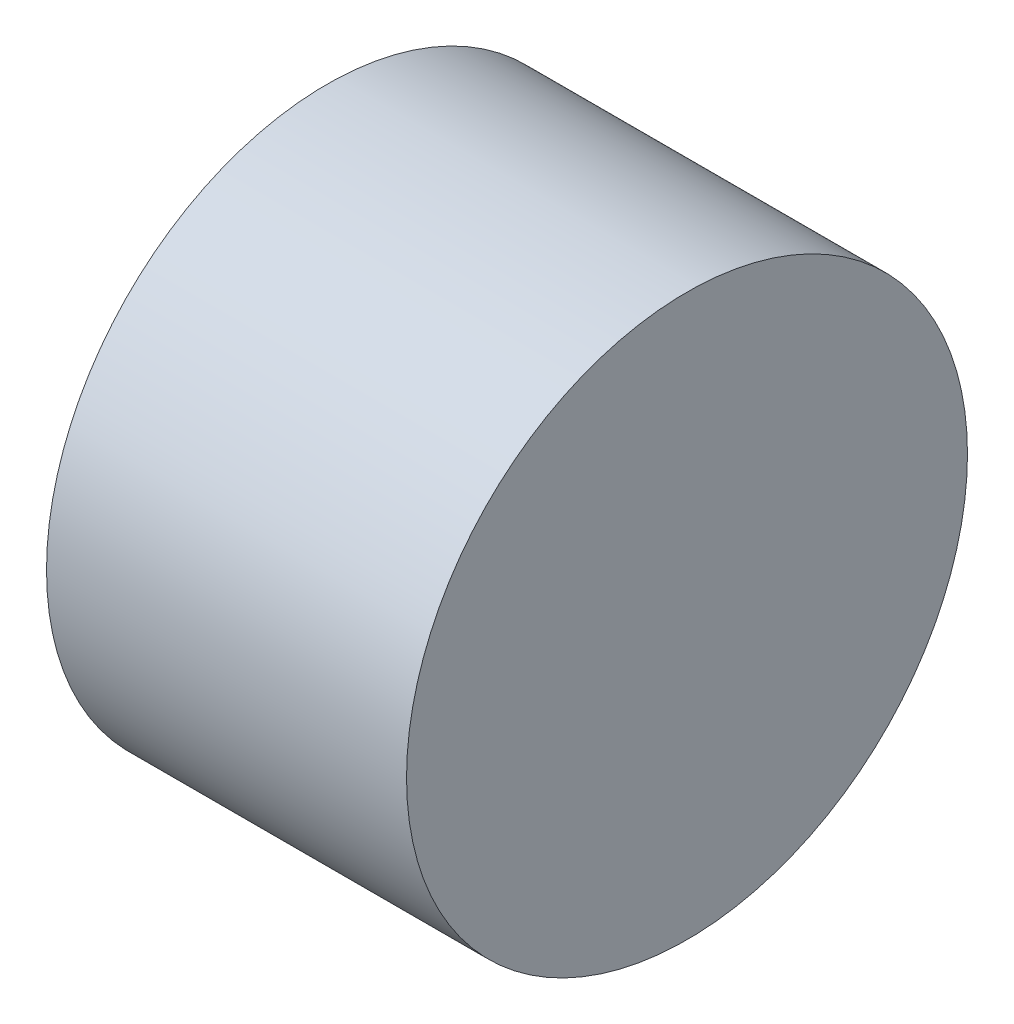
ISO-10303-21;
HEADER;
FILE_DESCRIPTION(('STEP AP214'),'2;1');
FILE_NAME('part.step','',(''),(''),'','','');
FILE_SCHEMA(('AUTOMOTIVE_DESIGN { 1 0 10303 214 1 1 1 1 }'));
ENDSEC;
DATA;
#1=APPLICATION_CONTEXT('core data for automotive mechanical design processes');
#2=APPLICATION_PROTOCOL_DEFINITION('international standard','automotive_design',2000,#1);
#3=PRODUCT_CONTEXT('',#1,'mechanical');
#4=PRODUCT('Part','Part','',(#3));
#5=PRODUCT_RELATED_PRODUCT_CATEGORY('part','',(#4));
#6=PRODUCT_DEFINITION_FORMATION('','',#4);
#7=PRODUCT_DEFINITION_CONTEXT('part definition',#1,'design');
#8=PRODUCT_DEFINITION('design','',#6,#7);
#9=PRODUCT_DEFINITION_SHAPE('','',#8);
#10=(LENGTH_UNIT() NAMED_UNIT(*) SI_UNIT(.MILLI.,.METRE.));
#11=(NAMED_UNIT(*) PLANE_ANGLE_UNIT() SI_UNIT($,.RADIAN.));
#12=(NAMED_UNIT(*) SI_UNIT($,.STERADIAN.) SOLID_ANGLE_UNIT());
#13=UNCERTAINTY_MEASURE_WITH_UNIT(LENGTH_MEASURE(1.E-05),#10,'distance_accuracy_value','');
#14=(GEOMETRIC_REPRESENTATION_CONTEXT(3) GLOBAL_UNCERTAINTY_ASSIGNED_CONTEXT((#13)) GLOBAL_UNIT_ASSIGNED_CONTEXT((#10,
#11,#12)) REPRESENTATION_CONTEXT('',''));
#15=CARTESIAN_POINT('',(0.,0.,0.));
#16=DIRECTION('',(0.,0.,1.));
#17=DIRECTION('',(1.,0.,0.));
#18=AXIS2_PLACEMENT_3D('',#15,#16,#17);
#19=CARTESIAN_POINT('',(21.5,0.,0.));
#20=DIRECTION('',(-1.,0.,0.));
#21=DIRECTION('',(0.,0.,1.));
#22=AXIS2_PLACEMENT_3D('',#19,#20,#21);
#23=CYLINDRICAL_SURFACE('',#22,16.75);
#24=CARTESIAN_POINT('',(21.5,0.,0.));
#25=DIRECTION('',(1.,0.,0.));
#26=DIRECTION('',(0.,0.,-1.));
#27=AXIS2_PLACEMENT_3D('',#24,#25,#26);
#28=CIRCLE('',#27,16.75);
#29=CARTESIAN_POINT('',(21.5,0.,-16.75));
#30=VERTEX_POINT('',#29);
#31=EDGE_CURVE('E10',#30,#30,#28,.T.);
#32=ORIENTED_EDGE('',*,*,#31,.F.);
#33=EDGE_LOOP('',(#32));
#34=FACE_BOUND('',#33,.T.);
#35=CARTESIAN_POINT('',(0.,0.,0.));
#36=DIRECTION('',(1.,0.,0.));
#37=DIRECTION('',(0.,0.,-1.));
#38=AXIS2_PLACEMENT_3D('',#35,#36,#37);
#39=CIRCLE('',#38,16.75);
#40=CARTESIAN_POINT('',(0.,0.,-16.75));
#41=VERTEX_POINT('',#40);
#42=EDGE_CURVE('E46',#41,#41,#39,.T.);
#43=ORIENTED_EDGE('',*,*,#42,.T.);
#44=EDGE_LOOP('',(#43));
#45=FACE_BOUND('',#44,.T.);
#46=ADVANCED_FACE('F43',(#34,#45),#23,.T.);
#47=CARTESIAN_POINT('',(21.5,0.,0.));
#48=DIRECTION('',(1.,0.,0.));
#49=DIRECTION('',(0.,0.,-1.));
#50=AXIS2_PLACEMENT_3D('',#47,#48,#49);
#51=PLANE('',#50);
#52=ORIENTED_EDGE('',*,*,#31,.T.);
#53=EDGE_LOOP('',(#52));
#54=FACE_BOUND('',#53,.T.);
#55=ADVANCED_FACE('F60',(#54),#51,.T.);
#56=CARTESIAN_POINT('',(0.,0.,0.));
#57=DIRECTION('',(1.,0.,0.));
#58=DIRECTION('',(0.,0.,-1.));
#59=AXIS2_PLACEMENT_3D('',#56,#57,#58);
#60=PLANE('',#59);
#61=ORIENTED_EDGE('',*,*,#42,.F.);
#62=EDGE_LOOP('',(#61));
#63=FACE_BOUND('',#62,.T.);
#64=ADVANCED_FACE('F58',(#63),#60,.F.);
#65=CLOSED_SHELL('',(#46,#55,#64));
#66=MANIFOLD_SOLID_BREP('B2',#65);
#67=ADVANCED_BREP_SHAPE_REPRESENTATION('',(#18,#66),#14);
#68=SHAPE_DEFINITION_REPRESENTATION(#9,#67);
ENDSEC;
END-ISO-10303-21;
